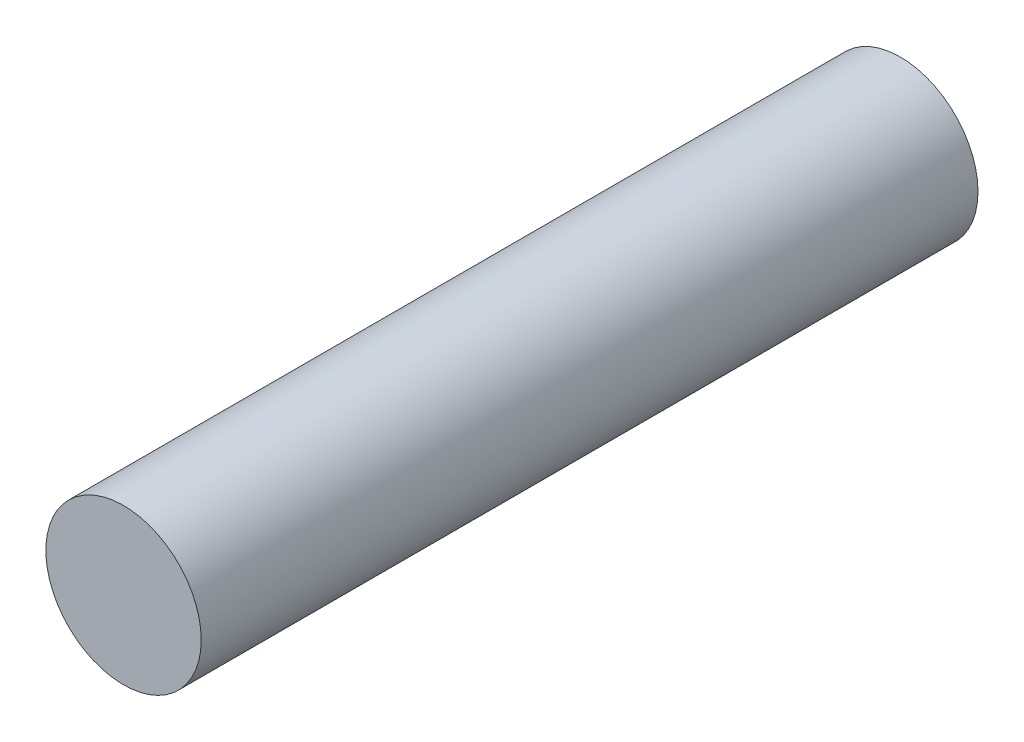
ISO-10303-21;
HEADER;
FILE_DESCRIPTION(('STEP AP214'),'2;1');
FILE_NAME('part.step','',(''),(''),'','','');
FILE_SCHEMA(('AUTOMOTIVE_DESIGN { 1 0 10303 214 1 1 1 1 }'));
ENDSEC;
DATA;
#1=APPLICATION_CONTEXT('core data for automotive mechanical design processes');
#2=APPLICATION_PROTOCOL_DEFINITION('international standard','automotive_design',2000,#1);
#3=PRODUCT_CONTEXT('',#1,'mechanical');
#4=PRODUCT('Part','Part','',(#3));
#5=PRODUCT_RELATED_PRODUCT_CATEGORY('part','',(#4));
#6=PRODUCT_DEFINITION_FORMATION('','',#4);
#7=PRODUCT_DEFINITION_CONTEXT('part definition',#1,'design');
#8=PRODUCT_DEFINITION('design','',#6,#7);
#9=PRODUCT_DEFINITION_SHAPE('','',#8);
#10=(LENGTH_UNIT() NAMED_UNIT(*) SI_UNIT(.MILLI.,.METRE.));
#11=(NAMED_UNIT(*) PLANE_ANGLE_UNIT() SI_UNIT($,.RADIAN.));
#12=(NAMED_UNIT(*) SI_UNIT($,.STERADIAN.) SOLID_ANGLE_UNIT());
#13=UNCERTAINTY_MEASURE_WITH_UNIT(LENGTH_MEASURE(1.E-05),#10,'distance_accuracy_value','');
#14=(GEOMETRIC_REPRESENTATION_CONTEXT(3) GLOBAL_UNCERTAINTY_ASSIGNED_CONTEXT((#13)) GLOBAL_UNIT_ASSIGNED_CONTEXT((#10,
#11,#12)) REPRESENTATION_CONTEXT('',''));
#15=CARTESIAN_POINT('',(0.,0.,0.));
#16=DIRECTION('',(0.,0.,1.));
#17=DIRECTION('',(1.,0.,0.));
#18=AXIS2_PLACEMENT_3D('',#15,#16,#17);
#19=CARTESIAN_POINT('',(0.,0.,4.445));
#20=DIRECTION('',(0.,0.,-1.));
#21=DIRECTION('',(-1.,0.,0.));
#22=AXIS2_PLACEMENT_3D('',#19,#20,#21);
#23=CYLINDRICAL_SURFACE('',#22,0.889);
#24=CARTESIAN_POINT('',(0.,0.,4.445));
#25=DIRECTION('',(0.,0.,1.));
#26=DIRECTION('',(1.,0.,0.));
#27=AXIS2_PLACEMENT_3D('',#24,#25,#26);
#28=CIRCLE('',#27,0.889);
#29=CARTESIAN_POINT('',(0.889,0.,4.445));
#30=VERTEX_POINT('',#29);
#31=EDGE_CURVE('E10',#30,#30,#28,.T.);
#32=ORIENTED_EDGE('',*,*,#31,.F.);
#33=EDGE_LOOP('',(#32));
#34=FACE_BOUND('',#33,.T.);
#35=CARTESIAN_POINT('',(0.,0.,-4.445));
#36=DIRECTION('',(0.,0.,1.));
#37=DIRECTION('',(1.,0.,0.));
#38=AXIS2_PLACEMENT_3D('',#35,#36,#37);
#39=CIRCLE('',#38,0.889);
#40=CARTESIAN_POINT('',(0.889,0.,-4.445));
#41=VERTEX_POINT('',#40);
#42=EDGE_CURVE('E56',#41,#41,#39,.T.);
#43=ORIENTED_EDGE('',*,*,#42,.T.);
#44=EDGE_LOOP('',(#43));
#45=FACE_BOUND('',#44,.T.);
#46=ADVANCED_FACE('F49',(#34,#45),#23,.T.);
#47=CARTESIAN_POINT('',(0.,0.,4.445));
#48=DIRECTION('',(0.,0.,1.));
#49=DIRECTION('',(1.,0.,0.));
#50=AXIS2_PLACEMENT_3D('',#47,#48,#49);
#51=PLANE('',#50);
#52=ORIENTED_EDGE('',*,*,#31,.T.);
#53=EDGE_LOOP('',(#52));
#54=FACE_BOUND('',#53,.T.);
#55=ADVANCED_FACE('F68',(#54),#51,.T.);
#56=CARTESIAN_POINT('',(0.,0.,-4.445));
#57=DIRECTION('',(0.,0.,1.));
#58=DIRECTION('',(1.,0.,0.));
#59=AXIS2_PLACEMENT_3D('',#56,#57,#58);
#60=PLANE('',#59);
#61=ORIENTED_EDGE('',*,*,#42,.F.);
#62=EDGE_LOOP('',(#61));
#63=FACE_BOUND('',#62,.T.);
#64=ADVANCED_FACE('F66',(#63),#60,.F.);
#65=CLOSED_SHELL('',(#46,#55,#64));
#66=MANIFOLD_SOLID_BREP('B2',#65);
#67=ADVANCED_BREP_SHAPE_REPRESENTATION('',(#18,#66),#14);
#68=SHAPE_DEFINITION_REPRESENTATION(#9,#67);
ENDSEC;
END-ISO-10303-21;
